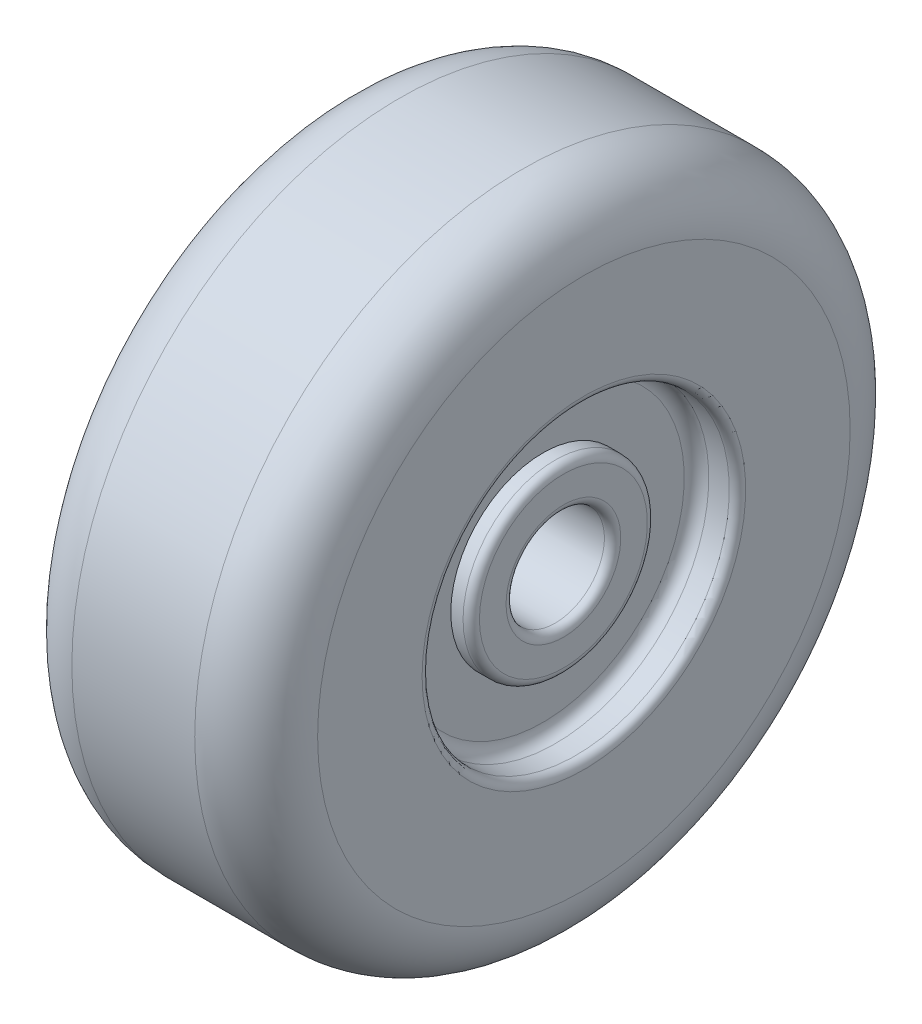
ISO-10303-21;
HEADER;
FILE_DESCRIPTION(('STEP AP214'),'2;1');
FILE_NAME('part.step','',(''),(''),'','','');
FILE_SCHEMA(('AUTOMOTIVE_DESIGN { 1 0 10303 214 1 1 1 1 }'));
ENDSEC;
DATA;
#1=APPLICATION_CONTEXT('core data for automotive mechanical design processes');
#2=APPLICATION_PROTOCOL_DEFINITION('international standard','automotive_design',2000,#1);
#3=PRODUCT_CONTEXT('',#1,'mechanical');
#4=PRODUCT('Part','Part','',(#3));
#5=PRODUCT_RELATED_PRODUCT_CATEGORY('part','',(#4));
#6=PRODUCT_DEFINITION_FORMATION('','',#4);
#7=PRODUCT_DEFINITION_CONTEXT('part definition',#1,'design');
#8=PRODUCT_DEFINITION('design','',#6,#7);
#9=PRODUCT_DEFINITION_SHAPE('','',#8);
#10=(LENGTH_UNIT() NAMED_UNIT(*) SI_UNIT(.MILLI.,.METRE.));
#11=(NAMED_UNIT(*) PLANE_ANGLE_UNIT() SI_UNIT($,.RADIAN.));
#12=(NAMED_UNIT(*) SI_UNIT($,.STERADIAN.) SOLID_ANGLE_UNIT());
#13=UNCERTAINTY_MEASURE_WITH_UNIT(LENGTH_MEASURE(1.E-05),#10,'distance_accuracy_value','');
#14=(GEOMETRIC_REPRESENTATION_CONTEXT(3) GLOBAL_UNCERTAINTY_ASSIGNED_CONTEXT((#13)) GLOBAL_UNIT_ASSIGNED_CONTEXT((#10,
#11,#12)) REPRESENTATION_CONTEXT('',''));
#15=CARTESIAN_POINT('',(0.,0.,0.));
#16=DIRECTION('',(0.,0.,1.));
#17=DIRECTION('',(1.,0.,0.));
#18=AXIS2_PLACEMENT_3D('',#15,#16,#17);
#19=CARTESIAN_POINT('',(1.5,0.,0.));
#20=DIRECTION('',(-1.,0.,0.));
#21=DIRECTION('',(0.,0.,1.));
#22=AXIS2_PLACEMENT_3D('',#19,#20,#21);
#23=TOROIDAL_SURFACE('',#22,6.5,1.5);
#24=CARTESIAN_POINT('',(1.5,0.,0.));
#25=DIRECTION('',(-1.,0.,0.));
#26=DIRECTION('',(0.,0.,1.));
#27=AXIS2_PLACEMENT_3D('',#24,#25,#26);
#28=CIRCLE('',#27,8.);
#29=CARTESIAN_POINT('',(1.5,0.,8.));
#30=VERTEX_POINT('',#29);
#31=EDGE_CURVE('E101',#30,#30,#28,.T.);
#32=ORIENTED_EDGE('',*,*,#31,.F.);
#33=EDGE_LOOP('',(#32));
#34=FACE_BOUND('',#33,.T.);
#35=CARTESIAN_POINT('',(3.,0.,0.));
#36=DIRECTION('',(-1.,0.,0.));
#37=DIRECTION('',(0.,0.,1.));
#38=AXIS2_PLACEMENT_3D('',#35,#36,#37);
#39=CIRCLE('',#38,6.5);
#40=CARTESIAN_POINT('',(3.,0.,6.5));
#41=VERTEX_POINT('',#40);
#42=EDGE_CURVE('E10',#41,#41,#39,.T.);
#43=ORIENTED_EDGE('',*,*,#42,.T.);
#44=EDGE_LOOP('',(#43));
#45=FACE_BOUND('',#44,.T.);
#46=ADVANCED_FACE('F31',(#34,#45),#23,.T.);
#47=CARTESIAN_POINT('',(3.,6.5,0.));
#48=DIRECTION('',(-1.,0.,0.));
#49=DIRECTION('',(0.,0.,1.));
#50=AXIS2_PLACEMENT_3D('',#47,#48,#49);
#51=PLANE('',#50);
#52=ORIENTED_EDGE('',*,*,#42,.F.);
#53=EDGE_LOOP('',(#52));
#54=FACE_BOUND('',#53,.T.);
#55=CARTESIAN_POINT('',(3.,0.,0.));
#56=DIRECTION('',(-1.,0.,0.));
#57=DIRECTION('',(0.,0.,1.));
#58=AXIS2_PLACEMENT_3D('',#55,#56,#57);
#59=CIRCLE('',#58,3.95);
#60=CARTESIAN_POINT('',(3.,0.,3.95));
#61=VERTEX_POINT('',#60);
#62=EDGE_CURVE('E37',#61,#61,#59,.T.);
#63=ORIENTED_EDGE('',*,*,#62,.T.);
#64=EDGE_LOOP('',(#63));
#65=FACE_BOUND('',#64,.T.);
#66=ADVANCED_FACE('F108',(#54,#65),#51,.F.);
#67=CARTESIAN_POINT('',(2.8,0.,0.));
#68=DIRECTION('',(-1.,0.,0.));
#69=DIRECTION('',(0.,0.,1.));
#70=AXIS2_PLACEMENT_3D('',#67,#68,#69);
#71=TOROIDAL_SURFACE('',#70,3.95,0.2);
#72=ORIENTED_EDGE('',*,*,#62,.F.);
#73=EDGE_LOOP('',(#72));
#74=FACE_BOUND('',#73,.T.);
#75=CARTESIAN_POINT('',(2.8,0.,0.));
#76=DIRECTION('',(-1.,0.,0.));
#77=DIRECTION('',(0.,0.,1.));
#78=AXIS2_PLACEMENT_3D('',#75,#76,#77);
#79=CIRCLE('',#78,3.75);
#80=CARTESIAN_POINT('',(2.8,0.,3.75));
#81=VERTEX_POINT('',#80);
#82=EDGE_CURVE('E41',#81,#81,#79,.T.);
#83=ORIENTED_EDGE('',*,*,#82,.T.);
#84=EDGE_LOOP('',(#83));
#85=FACE_BOUND('',#84,.T.);
#86=ADVANCED_FACE('F112',(#74,#85),#71,.T.);
#87=CARTESIAN_POINT('',(0.,0.,0.));
#88=DIRECTION('',(-1.,0.,0.));
#89=DIRECTION('',(0.,0.,1.));
#90=AXIS2_PLACEMENT_3D('',#87,#88,#89);
#91=CYLINDRICAL_SURFACE('',#90,3.75);
#92=ORIENTED_EDGE('',*,*,#82,.F.);
#93=EDGE_LOOP('',(#92));
#94=FACE_BOUND('',#93,.T.);
#95=CARTESIAN_POINT('',(2.3,0.,0.));
#96=DIRECTION('',(-1.,0.,0.));
#97=DIRECTION('',(0.,0.,1.));
#98=AXIS2_PLACEMENT_3D('',#95,#96,#97);
#99=CIRCLE('',#98,3.75);
#100=CARTESIAN_POINT('',(2.3,0.,3.75));
#101=VERTEX_POINT('',#100);
#102=EDGE_CURVE('E45',#101,#101,#99,.T.);
#103=ORIENTED_EDGE('',*,*,#102,.T.);
#104=EDGE_LOOP('',(#103));
#105=FACE_BOUND('',#104,.T.);
#106=ADVANCED_FACE('F117',(#94,#105),#91,.F.);
#107=CARTESIAN_POINT('',(2.3,0.,0.));
#108=DIRECTION('',(-1.,0.,0.));
#109=DIRECTION('',(0.,0.,1.));
#110=AXIS2_PLACEMENT_3D('',#107,#108,#109);
#111=TOROIDAL_SURFACE('',#110,3.45,0.3);
#112=ORIENTED_EDGE('',*,*,#102,.F.);
#113=EDGE_LOOP('',(#112));
#114=FACE_BOUND('',#113,.T.);
#115=CARTESIAN_POINT('',(2.,0.,0.));
#116=DIRECTION('',(-1.,0.,0.));
#117=DIRECTION('',(0.,0.,1.));
#118=AXIS2_PLACEMENT_3D('',#115,#116,#117);
#119=CIRCLE('',#118,3.45);
#120=CARTESIAN_POINT('',(2.,0.,3.45));
#121=VERTEX_POINT('',#120);
#122=EDGE_CURVE('E50',#121,#121,#119,.T.);
#123=ORIENTED_EDGE('',*,*,#122,.T.);
#124=EDGE_LOOP('',(#123));
#125=FACE_BOUND('',#124,.T.);
#126=ADVANCED_FACE('F123',(#114,#125),#111,.F.);
#127=CARTESIAN_POINT('',(2.,3.45,0.));
#128=DIRECTION('',(-1.,0.,0.));
#129=DIRECTION('',(0.,0.,1.));
#130=AXIS2_PLACEMENT_3D('',#127,#128,#129);
#131=PLANE('',#130);
#132=ORIENTED_EDGE('',*,*,#122,.F.);
#133=EDGE_LOOP('',(#132));
#134=FACE_BOUND('',#133,.T.);
#135=CARTESIAN_POINT('',(2.,0.,0.));
#136=DIRECTION('',(-1.,0.,0.));
#137=DIRECTION('',(0.,0.,1.));
#138=AXIS2_PLACEMENT_3D('',#135,#136,#137);
#139=CIRCLE('',#138,2.25);
#140=CARTESIAN_POINT('',(2.,0.,2.25));
#141=VERTEX_POINT('',#140);
#142=EDGE_CURVE('E53',#141,#141,#139,.T.);
#143=ORIENTED_EDGE('',*,*,#142,.T.);
#144=EDGE_LOOP('',(#143));
#145=FACE_BOUND('',#144,.T.);
#146=ADVANCED_FACE('F127',(#134,#145),#131,.F.);
#147=CARTESIAN_POINT('',(0.,0.,0.));
#148=DIRECTION('',(-1.,0.,0.));
#149=DIRECTION('',(0.,0.,1.));
#150=AXIS2_PLACEMENT_3D('',#147,#148,#149);
#151=CYLINDRICAL_SURFACE('',#150,2.25);
#152=ORIENTED_EDGE('',*,*,#142,.F.);
#153=EDGE_LOOP('',(#152));
#154=FACE_BOUND('',#153,.T.);
#155=CARTESIAN_POINT('',(2.3,0.,0.));
#156=DIRECTION('',(-1.,0.,0.));
#157=DIRECTION('',(0.,0.,1.));
#158=AXIS2_PLACEMENT_3D('',#155,#156,#157);
#159=CIRCLE('',#158,2.25);
#160=CARTESIAN_POINT('',(2.3,0.,2.25));
#161=VERTEX_POINT('',#160);
#162=EDGE_CURVE('E56',#161,#161,#159,.T.);
#163=ORIENTED_EDGE('',*,*,#162,.T.);
#164=EDGE_LOOP('',(#163));
#165=FACE_BOUND('',#164,.T.);
#166=ADVANCED_FACE('F131',(#154,#165),#151,.T.);
#167=CARTESIAN_POINT('',(2.3,0.,0.));
#168=DIRECTION('',(-1.,0.,0.));
#169=DIRECTION('',(0.,0.,1.));
#170=AXIS2_PLACEMENT_3D('',#167,#168,#169);
#171=TOROIDAL_SURFACE('',#170,2.05,0.2);
#172=ORIENTED_EDGE('',*,*,#162,.F.);
#173=EDGE_LOOP('',(#172));
#174=FACE_BOUND('',#173,.T.);
#175=CARTESIAN_POINT('',(2.5,0.,0.));
#176=DIRECTION('',(-1.,0.,0.));
#177=DIRECTION('',(0.,0.,1.));
#178=AXIS2_PLACEMENT_3D('',#175,#176,#177);
#179=CIRCLE('',#178,2.05);
#180=CARTESIAN_POINT('',(2.5,0.,2.05));
#181=VERTEX_POINT('',#180);
#182=EDGE_CURVE('E59',#181,#181,#179,.T.);
#183=ORIENTED_EDGE('',*,*,#182,.T.);
#184=EDGE_LOOP('',(#183));
#185=FACE_BOUND('',#184,.T.);
#186=ADVANCED_FACE('F135',(#174,#185),#171,.T.);
#187=CARTESIAN_POINT('',(2.5,1.4,0.));
#188=DIRECTION('',(-1.,0.,0.));
#189=DIRECTION('',(0.,0.,1.));
#190=AXIS2_PLACEMENT_3D('',#187,#188,#189);
#191=PLANE('',#190);
#192=ORIENTED_EDGE('',*,*,#182,.F.);
#193=EDGE_LOOP('',(#192));
#194=FACE_BOUND('',#193,.T.);
#195=CARTESIAN_POINT('',(2.5,0.,0.));
#196=DIRECTION('',(-1.,0.,0.));
#197=DIRECTION('',(0.,0.,1.));
#198=AXIS2_PLACEMENT_3D('',#195,#196,#197);
#199=CIRCLE('',#198,1.4);
#200=CARTESIAN_POINT('',(2.5,0.,1.4));
#201=VERTEX_POINT('',#200);
#202=EDGE_CURVE('E62',#201,#201,#199,.T.);
#203=ORIENTED_EDGE('',*,*,#202,.T.);
#204=EDGE_LOOP('',(#203));
#205=FACE_BOUND('',#204,.T.);
#206=ADVANCED_FACE('F139',(#194,#205),#191,.F.);
#207=CARTESIAN_POINT('',(2.3,0.,0.));
#208=DIRECTION('',(-1.,0.,0.));
#209=DIRECTION('',(0.,0.,1.));
#210=AXIS2_PLACEMENT_3D('',#207,#208,#209);
#211=TOROIDAL_SURFACE('',#210,1.4,0.2);
#212=ORIENTED_EDGE('',*,*,#202,.F.);
#213=EDGE_LOOP('',(#212));
#214=FACE_BOUND('',#213,.T.);
#215=CARTESIAN_POINT('',(2.3,0.,0.));
#216=DIRECTION('',(-1.,0.,0.));
#217=DIRECTION('',(0.,0.,1.));
#218=AXIS2_PLACEMENT_3D('',#215,#216,#217);
#219=CIRCLE('',#218,1.2);
#220=CARTESIAN_POINT('',(2.3,0.,1.2));
#221=VERTEX_POINT('',#220);
#222=EDGE_CURVE('E65',#221,#221,#219,.T.);
#223=ORIENTED_EDGE('',*,*,#222,.T.);
#224=EDGE_LOOP('',(#223));
#225=FACE_BOUND('',#224,.T.);
#226=ADVANCED_FACE('F143',(#214,#225),#211,.T.);
#227=CARTESIAN_POINT('',(0.,0.,0.));
#228=DIRECTION('',(-1.,0.,0.));
#229=DIRECTION('',(0.,0.,1.));
#230=AXIS2_PLACEMENT_3D('',#227,#228,#229);
#231=CYLINDRICAL_SURFACE('',#230,1.2);
#232=ORIENTED_EDGE('',*,*,#222,.F.);
#233=EDGE_LOOP('',(#232));
#234=FACE_BOUND('',#233,.T.);
#235=CARTESIAN_POINT('',(-2.3,0.,0.));
#236=DIRECTION('',(-1.,0.,0.));
#237=DIRECTION('',(0.,0.,1.));
#238=AXIS2_PLACEMENT_3D('',#235,#236,#237);
#239=CIRCLE('',#238,1.2);
#240=CARTESIAN_POINT('',(-2.3,0.,1.2));
#241=VERTEX_POINT('',#240);
#242=EDGE_CURVE('E68',#241,#241,#239,.T.);
#243=ORIENTED_EDGE('',*,*,#242,.T.);
#244=EDGE_LOOP('',(#243));
#245=FACE_BOUND('',#244,.T.);
#246=ADVANCED_FACE('F147',(#234,#245),#231,.F.);
#247=CARTESIAN_POINT('',(-2.3,0.,0.));
#248=DIRECTION('',(-1.,0.,0.));
#249=DIRECTION('',(0.,0.,1.));
#250=AXIS2_PLACEMENT_3D('',#247,#248,#249);
#251=TOROIDAL_SURFACE('',#250,1.4,0.2);
#252=ORIENTED_EDGE('',*,*,#242,.F.);
#253=EDGE_LOOP('',(#252));
#254=FACE_BOUND('',#253,.T.);
#255=CARTESIAN_POINT('',(-2.5,0.,0.));
#256=DIRECTION('',(-1.,0.,0.));
#257=DIRECTION('',(0.,0.,1.));
#258=AXIS2_PLACEMENT_3D('',#255,#256,#257);
#259=CIRCLE('',#258,1.4);
#260=CARTESIAN_POINT('',(-2.5,0.,1.4));
#261=VERTEX_POINT('',#260);
#262=EDGE_CURVE('E71',#261,#261,#259,.T.);
#263=ORIENTED_EDGE('',*,*,#262,.T.);
#264=EDGE_LOOP('',(#263));
#265=FACE_BOUND('',#264,.T.);
#266=ADVANCED_FACE('F151',(#254,#265),#251,.T.);
#267=CARTESIAN_POINT('',(-2.5,1.4,0.));
#268=DIRECTION('',(1.,0.,0.));
#269=DIRECTION('',(0.,0.,-1.));
#270=AXIS2_PLACEMENT_3D('',#267,#268,#269);
#271=PLANE('',#270);
#272=ORIENTED_EDGE('',*,*,#262,.F.);
#273=EDGE_LOOP('',(#272));
#274=FACE_BOUND('',#273,.T.);
#275=CARTESIAN_POINT('',(-2.5,0.,0.));
#276=DIRECTION('',(-1.,0.,0.));
#277=DIRECTION('',(0.,0.,1.));
#278=AXIS2_PLACEMENT_3D('',#275,#276,#277);
#279=CIRCLE('',#278,2.05);
#280=CARTESIAN_POINT('',(-2.5,0.,2.05));
#281=VERTEX_POINT('',#280);
#282=EDGE_CURVE('E74',#281,#281,#279,.T.);
#283=ORIENTED_EDGE('',*,*,#282,.T.);
#284=EDGE_LOOP('',(#283));
#285=FACE_BOUND('',#284,.T.);
#286=ADVANCED_FACE('F155',(#274,#285),#271,.F.);
#287=CARTESIAN_POINT('',(-2.3,0.,0.));
#288=DIRECTION('',(-1.,0.,0.));
#289=DIRECTION('',(0.,0.,1.));
#290=AXIS2_PLACEMENT_3D('',#287,#288,#289);
#291=TOROIDAL_SURFACE('',#290,2.05,0.2);
#292=ORIENTED_EDGE('',*,*,#282,.F.);
#293=EDGE_LOOP('',(#292));
#294=FACE_BOUND('',#293,.T.);
#295=CARTESIAN_POINT('',(-2.3,0.,0.));
#296=DIRECTION('',(-1.,0.,0.));
#297=DIRECTION('',(0.,0.,1.));
#298=AXIS2_PLACEMENT_3D('',#295,#296,#297);
#299=CIRCLE('',#298,2.25);
#300=CARTESIAN_POINT('',(-2.3,0.,2.25));
#301=VERTEX_POINT('',#300);
#302=EDGE_CURVE('E77',#301,#301,#299,.T.);
#303=ORIENTED_EDGE('',*,*,#302,.T.);
#304=EDGE_LOOP('',(#303));
#305=FACE_BOUND('',#304,.T.);
#306=ADVANCED_FACE('F159',(#294,#305),#291,.T.);
#307=CARTESIAN_POINT('',(0.,0.,0.));
#308=DIRECTION('',(-1.,0.,0.));
#309=DIRECTION('',(0.,0.,1.));
#310=AXIS2_PLACEMENT_3D('',#307,#308,#309);
#311=CYLINDRICAL_SURFACE('',#310,2.25);
#312=ORIENTED_EDGE('',*,*,#302,.F.);
#313=EDGE_LOOP('',(#312));
#314=FACE_BOUND('',#313,.T.);
#315=CARTESIAN_POINT('',(-2.,0.,0.));
#316=DIRECTION('',(-1.,0.,0.));
#317=DIRECTION('',(0.,0.,1.));
#318=AXIS2_PLACEMENT_3D('',#315,#316,#317);
#319=CIRCLE('',#318,2.25);
#320=CARTESIAN_POINT('',(-2.,0.,2.25));
#321=VERTEX_POINT('',#320);
#322=EDGE_CURVE('E80',#321,#321,#319,.T.);
#323=ORIENTED_EDGE('',*,*,#322,.T.);
#324=EDGE_LOOP('',(#323));
#325=FACE_BOUND('',#324,.T.);
#326=ADVANCED_FACE('F163',(#314,#325),#311,.T.);
#327=CARTESIAN_POINT('',(-2.,3.45,0.));
#328=DIRECTION('',(1.,0.,0.));
#329=DIRECTION('',(0.,0.,-1.));
#330=AXIS2_PLACEMENT_3D('',#327,#328,#329);
#331=PLANE('',#330);
#332=ORIENTED_EDGE('',*,*,#322,.F.);
#333=EDGE_LOOP('',(#332));
#334=FACE_BOUND('',#333,.T.);
#335=CARTESIAN_POINT('',(-2.,0.,0.));
#336=DIRECTION('',(-1.,0.,0.));
#337=DIRECTION('',(0.,0.,1.));
#338=AXIS2_PLACEMENT_3D('',#335,#336,#337);
#339=CIRCLE('',#338,3.45);
#340=CARTESIAN_POINT('',(-2.,0.,3.45));
#341=VERTEX_POINT('',#340);
#342=EDGE_CURVE('E83',#341,#341,#339,.T.);
#343=ORIENTED_EDGE('',*,*,#342,.T.);
#344=EDGE_LOOP('',(#343));
#345=FACE_BOUND('',#344,.T.);
#346=ADVANCED_FACE('F167',(#334,#345),#331,.F.);
#347=CARTESIAN_POINT('',(-2.3,0.,0.));
#348=DIRECTION('',(-1.,0.,0.));
#349=DIRECTION('',(0.,0.,1.));
#350=AXIS2_PLACEMENT_3D('',#347,#348,#349);
#351=TOROIDAL_SURFACE('',#350,3.45,0.3);
#352=ORIENTED_EDGE('',*,*,#342,.F.);
#353=EDGE_LOOP('',(#352));
#354=FACE_BOUND('',#353,.T.);
#355=CARTESIAN_POINT('',(-2.3,0.,0.));
#356=DIRECTION('',(-1.,0.,0.));
#357=DIRECTION('',(0.,0.,1.));
#358=AXIS2_PLACEMENT_3D('',#355,#356,#357);
#359=CIRCLE('',#358,3.75);
#360=CARTESIAN_POINT('',(-2.3,0.,3.75));
#361=VERTEX_POINT('',#360);
#362=EDGE_CURVE('E86',#361,#361,#359,.T.);
#363=ORIENTED_EDGE('',*,*,#362,.T.);
#364=EDGE_LOOP('',(#363));
#365=FACE_BOUND('',#364,.T.);
#366=ADVANCED_FACE('F171',(#354,#365),#351,.F.);
#367=CARTESIAN_POINT('',(0.,0.,0.));
#368=DIRECTION('',(-1.,0.,0.));
#369=DIRECTION('',(0.,0.,1.));
#370=AXIS2_PLACEMENT_3D('',#367,#368,#369);
#371=CYLINDRICAL_SURFACE('',#370,3.75);
#372=ORIENTED_EDGE('',*,*,#362,.F.);
#373=EDGE_LOOP('',(#372));
#374=FACE_BOUND('',#373,.T.);
#375=CARTESIAN_POINT('',(-2.8,0.,0.));
#376=DIRECTION('',(-1.,0.,0.));
#377=DIRECTION('',(0.,0.,1.));
#378=AXIS2_PLACEMENT_3D('',#375,#376,#377);
#379=CIRCLE('',#378,3.75);
#380=CARTESIAN_POINT('',(-2.8,0.,3.75));
#381=VERTEX_POINT('',#380);
#382=EDGE_CURVE('E89',#381,#381,#379,.T.);
#383=ORIENTED_EDGE('',*,*,#382,.T.);
#384=EDGE_LOOP('',(#383));
#385=FACE_BOUND('',#384,.T.);
#386=ADVANCED_FACE('F175',(#374,#385),#371,.F.);
#387=CARTESIAN_POINT('',(-2.8,0.,0.));
#388=DIRECTION('',(-1.,0.,0.));
#389=DIRECTION('',(0.,0.,1.));
#390=AXIS2_PLACEMENT_3D('',#387,#388,#389);
#391=TOROIDAL_SURFACE('',#390,3.95,0.2);
#392=ORIENTED_EDGE('',*,*,#382,.F.);
#393=EDGE_LOOP('',(#392));
#394=FACE_BOUND('',#393,.T.);
#395=CARTESIAN_POINT('',(-3.,0.,0.));
#396=DIRECTION('',(-1.,0.,0.));
#397=DIRECTION('',(0.,0.,1.));
#398=AXIS2_PLACEMENT_3D('',#395,#396,#397);
#399=CIRCLE('',#398,3.95);
#400=CARTESIAN_POINT('',(-3.,0.,3.95));
#401=VERTEX_POINT('',#400);
#402=EDGE_CURVE('E92',#401,#401,#399,.T.);
#403=ORIENTED_EDGE('',*,*,#402,.T.);
#404=EDGE_LOOP('',(#403));
#405=FACE_BOUND('',#404,.T.);
#406=ADVANCED_FACE('F179',(#394,#405),#391,.T.);
#407=CARTESIAN_POINT('',(-3.,6.5,0.));
#408=DIRECTION('',(1.,0.,0.));
#409=DIRECTION('',(0.,0.,-1.));
#410=AXIS2_PLACEMENT_3D('',#407,#408,#409);
#411=PLANE('',#410);
#412=ORIENTED_EDGE('',*,*,#402,.F.);
#413=EDGE_LOOP('',(#412));
#414=FACE_BOUND('',#413,.T.);
#415=CARTESIAN_POINT('',(-3.,0.,0.));
#416=DIRECTION('',(-1.,0.,0.));
#417=DIRECTION('',(0.,0.,1.));
#418=AXIS2_PLACEMENT_3D('',#415,#416,#417);
#419=CIRCLE('',#418,6.5);
#420=CARTESIAN_POINT('',(-3.,0.,6.5));
#421=VERTEX_POINT('',#420);
#422=EDGE_CURVE('E95',#421,#421,#419,.T.);
#423=ORIENTED_EDGE('',*,*,#422,.T.);
#424=EDGE_LOOP('',(#423));
#425=FACE_BOUND('',#424,.T.);
#426=ADVANCED_FACE('F183',(#414,#425),#411,.F.);
#427=CARTESIAN_POINT('',(-1.5,0.,0.));
#428=DIRECTION('',(-1.,0.,0.));
#429=DIRECTION('',(0.,0.,1.));
#430=AXIS2_PLACEMENT_3D('',#427,#428,#429);
#431=TOROIDAL_SURFACE('',#430,6.5,1.5);
#432=ORIENTED_EDGE('',*,*,#422,.F.);
#433=EDGE_LOOP('',(#432));
#434=FACE_BOUND('',#433,.T.);
#435=CARTESIAN_POINT('',(-1.5,0.,0.));
#436=DIRECTION('',(-1.,0.,0.));
#437=DIRECTION('',(0.,0.,1.));
#438=AXIS2_PLACEMENT_3D('',#435,#436,#437);
#439=CIRCLE('',#438,8.);
#440=CARTESIAN_POINT('',(-1.5,0.,8.));
#441=VERTEX_POINT('',#440);
#442=EDGE_CURVE('E98',#441,#441,#439,.T.);
#443=ORIENTED_EDGE('',*,*,#442,.T.);
#444=EDGE_LOOP('',(#443));
#445=FACE_BOUND('',#444,.T.);
#446=ADVANCED_FACE('F187',(#434,#445),#431,.T.);
#447=CARTESIAN_POINT('',(0.,0.,0.));
#448=DIRECTION('',(-1.,0.,0.));
#449=DIRECTION('',(0.,0.,1.));
#450=AXIS2_PLACEMENT_3D('',#447,#448,#449);
#451=CYLINDRICAL_SURFACE('',#450,8.);
#452=ORIENTED_EDGE('',*,*,#442,.F.);
#453=EDGE_LOOP('',(#452));
#454=FACE_BOUND('',#453,.T.);
#455=ORIENTED_EDGE('',*,*,#31,.T.);
#456=EDGE_LOOP('',(#455));
#457=FACE_BOUND('',#456,.T.);
#458=ADVANCED_FACE('F105',(#454,#457),#451,.T.);
#459=CLOSED_SHELL('',(#46,#66,#86,#106,#126,#146,#166,#186,#206,#226,#246,#266,#286,#306,#326,
#346,#366,#386,#406,#426,#446,#458));
#460=MANIFOLD_SOLID_BREP('B2',#459);
#461=ADVANCED_BREP_SHAPE_REPRESENTATION('',(#18,#460),#14);
#462=SHAPE_DEFINITION_REPRESENTATION(#9,#461);
ENDSEC;
END-ISO-10303-21;
